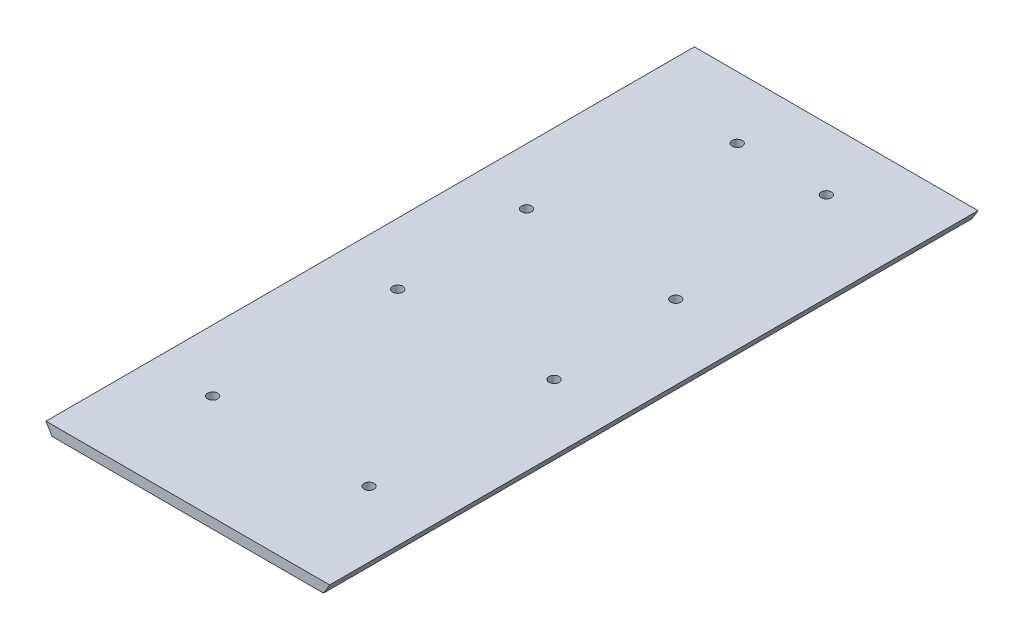
ISO-10303-21;
HEADER;
FILE_DESCRIPTION(('STEP AP214'),'2;1');
FILE_NAME('part.step','',(''),(''),'','','');
FILE_SCHEMA(('AUTOMOTIVE_DESIGN { 1 0 10303 214 1 1 1 1 }'));
ENDSEC;
DATA;
#1=APPLICATION_CONTEXT('core data for automotive mechanical design processes');
#2=APPLICATION_PROTOCOL_DEFINITION('international standard','automotive_design',2000,#1);
#3=PRODUCT_CONTEXT('',#1,'mechanical');
#4=PRODUCT('Part','Part','',(#3));
#5=PRODUCT_RELATED_PRODUCT_CATEGORY('part','',(#4));
#6=PRODUCT_DEFINITION_FORMATION('','',#4);
#7=PRODUCT_DEFINITION_CONTEXT('part definition',#1,'design');
#8=PRODUCT_DEFINITION('design','',#6,#7);
#9=PRODUCT_DEFINITION_SHAPE('','',#8);
#10=(LENGTH_UNIT() NAMED_UNIT(*) SI_UNIT(.MILLI.,.METRE.));
#11=(NAMED_UNIT(*) PLANE_ANGLE_UNIT() SI_UNIT($,.RADIAN.));
#12=(NAMED_UNIT(*) SI_UNIT($,.STERADIAN.) SOLID_ANGLE_UNIT());
#13=UNCERTAINTY_MEASURE_WITH_UNIT(LENGTH_MEASURE(1.E-05),#10,'distance_accuracy_value','');
#14=(GEOMETRIC_REPRESENTATION_CONTEXT(3) GLOBAL_UNCERTAINTY_ASSIGNED_CONTEXT((#13)) GLOBAL_UNIT_ASSIGNED_CONTEXT((#10,
#11,#12)) REPRESENTATION_CONTEXT('',''));
#15=CARTESIAN_POINT('',(0.,0.,0.));
#16=DIRECTION('',(0.,0.,1.));
#17=DIRECTION('',(1.,0.,0.));
#18=AXIS2_PLACEMENT_3D('',#15,#16,#17);
#19=CARTESIAN_POINT('',(42.5222556068552,-27.7938442484171,203.2));
#20=DIRECTION('',(0.,-1.,0.));
#21=DIRECTION('',(0.,0.,-1.));
#22=AXIS2_PLACEMENT_3D('',#19,#20,#21);
#23=PLANE('',#22);
#24=CARTESIAN_POINT('',(-25.15241720624,-27.7938442484171,112.253365494015));
#25=DIRECTION('',(0.,1.,0.));
#26=DIRECTION('',(0.,0.,1.));
#27=AXIS2_PLACEMENT_3D('',#24,#25,#26);
#28=CIRCLE('',#27,1.5875);
#29=CARTESIAN_POINT('',(-25.15241720624,-27.7938442484171,113.840865494015));
#30=VERTEX_POINT('',#29);
#31=EDGE_CURVE('E124',#30,#30,#28,.T.);
#32=ORIENTED_EDGE('',*,*,#31,.T.);
#33=EDGE_LOOP('',(#32));
#34=FACE_BOUND('',#33,.T.);
#35=CARTESIAN_POINT('',(-25.15241720624,-27.7938442484171,170.253365494015));
#36=DIRECTION('',(0.,1.,0.));
#37=DIRECTION('',(0.,0.,1.));
#38=AXIS2_PLACEMENT_3D('',#35,#36,#37);
#39=CIRCLE('',#38,1.5875);
#40=CARTESIAN_POINT('',(-25.15241720624,-27.7938442484171,171.840865494015));
#41=VERTEX_POINT('',#40);
#42=EDGE_CURVE('E138',#41,#41,#39,.F.);
#43=ORIENTED_EDGE('',*,*,#42,.F.);
#44=EDGE_LOOP('',(#43));
#45=FACE_BOUND('',#44,.T.);
#46=CARTESIAN_POINT('',(-11.5382422939092,-27.7938442484171,19.4789252926029));
#47=DIRECTION('',(0.,1.,0.));
#48=DIRECTION('',(0.,0.,1.));
#49=AXIS2_PLACEMENT_3D('',#46,#47,#48);
#50=CIRCLE('',#49,1.5875);
#51=CARTESIAN_POINT('',(-11.5382422939092,-27.7938442484171,21.0664252926029));
#52=VERTEX_POINT('',#51);
#53=EDGE_CURVE('E144',#52,#52,#50,.T.);
#54=ORIENTED_EDGE('',*,*,#53,.T.);
#55=EDGE_LOOP('',(#54));
#56=FACE_BOUND('',#55,.T.);
#57=CARTESIAN_POINT('',(21.1379269920427,-27.7938442484171,71.4219252926028));
#58=DIRECTION('',(0.,1.,0.));
#59=DIRECTION('',(0.,0.,1.));
#60=AXIS2_PLACEMENT_3D('',#57,#58,#59);
#61=CIRCLE('',#60,1.5875);
#62=CARTESIAN_POINT('',(21.1379269920427,-27.7938442484171,73.0094252926028));
#63=VERTEX_POINT('',#62);
#64=EDGE_CURVE('E150',#63,#63,#61,.T.);
#65=ORIENTED_EDGE('',*,*,#64,.T.);
#66=EDGE_LOOP('',(#65));
#67=FACE_BOUND('',#66,.T.);
#68=CARTESIAN_POINT('',(-26.7782422939092,-27.7938442484171,70.2789252926029));
#69=DIRECTION('',(0.,1.,0.));
#70=DIRECTION('',(0.,0.,1.));
#71=AXIS2_PLACEMENT_3D('',#68,#69,#70);
#72=CIRCLE('',#71,1.5875);
#73=CARTESIAN_POINT('',(-26.7782422939092,-27.7938442484171,71.8664252926029));
#74=VERTEX_POINT('',#73);
#75=EDGE_CURVE('E156',#74,#74,#72,.T.);
#76=ORIENTED_EDGE('',*,*,#75,.T.);
#77=EDGE_LOOP('',(#76));
#78=FACE_BOUND('',#77,.T.);
#79=CARTESIAN_POINT('',(16.4017577060908,-27.7938442484171,19.4789252926029));
#80=DIRECTION('',(0.,1.,0.));
#81=DIRECTION('',(0.,0.,1.));
#82=AXIS2_PLACEMENT_3D('',#79,#80,#81);
#83=CIRCLE('',#82,1.5875);
#84=CARTESIAN_POINT('',(16.4017577060908,-27.7938442484171,21.0664252926029));
#85=VERTEX_POINT('',#84);
#86=EDGE_CURVE('E101',#85,#85,#83,.T.);
#87=ORIENTED_EDGE('',*,*,#86,.T.);
#88=EDGE_LOOP('',(#87));
#89=FACE_BOUND('',#88,.T.);
#90=DIRECTION('',(-1.,0.,0.));
#91=VECTOR('',#90,1.);
#92=CARTESIAN_POINT('',(42.5222556068552,-27.7938442484171,0.));
#93=LINE('',#92,#91);
#94=CARTESIAN_POINT('',(42.5222556068552,-27.7938442484171,0.));
#95=VERTEX_POINT('',#94);
#96=CARTESIAN_POINT('',(-42.5222556068552,-27.7938442484171,0.));
#97=VERTEX_POINT('',#96);
#98=EDGE_CURVE('E85',#95,#97,#93,.T.);
#99=ORIENTED_EDGE('',*,*,#98,.F.);
#100=DIRECTION('',(0.,0.,-1.));
#101=VECTOR('',#100,1.);
#102=CARTESIAN_POINT('',(42.5222556068552,-27.7938442484171,203.2));
#103=LINE('',#102,#101);
#104=CARTESIAN_POINT('',(42.5222556068552,-27.7938442484171,203.2));
#105=VERTEX_POINT('',#104);
#106=EDGE_CURVE('E42',#105,#95,#103,.T.);
#107=ORIENTED_EDGE('',*,*,#106,.F.);
#108=DIRECTION('',(-1.,0.,0.));
#109=VECTOR('',#108,1.);
#110=CARTESIAN_POINT('',(42.5222556068552,-27.7938442484171,203.2));
#111=LINE('',#110,#109);
#112=CARTESIAN_POINT('',(-42.5222556068552,-27.7938442484171,203.2));
#113=VERTEX_POINT('',#112);
#114=EDGE_CURVE('E83',#105,#113,#111,.T.);
#115=ORIENTED_EDGE('',*,*,#114,.T.);
#116=DIRECTION('',(0.,0.,-1.));
#117=VECTOR('',#116,1.);
#118=CARTESIAN_POINT('',(-42.5222556068552,-27.7938442484171,203.2));
#119=LINE('',#118,#117);
#120=EDGE_CURVE('E11',#113,#97,#119,.T.);
#121=ORIENTED_EDGE('',*,*,#120,.T.);
#122=EDGE_LOOP('',(#99,#107,#115,#121));
#123=FACE_BOUND('',#122,.T.);
#124=CARTESIAN_POINT('',(23.8475827937601,-27.7938442484171,170.253365494015));
#125=DIRECTION('',(0.,1.,0.));
#126=DIRECTION('',(0.,0.,1.));
#127=AXIS2_PLACEMENT_3D('',#124,#125,#126);
#128=CIRCLE('',#127,1.5875);
#129=CARTESIAN_POINT('',(23.8475827937601,-27.7938442484171,171.840865494015));
#130=VERTEX_POINT('',#129);
#131=EDGE_CURVE('E133',#130,#130,#128,.T.);
#132=ORIENTED_EDGE('',*,*,#131,.T.);
#133=EDGE_LOOP('',(#132));
#134=FACE_BOUND('',#133,.T.);
#135=CARTESIAN_POINT('',(23.8475827937601,-27.7938442484171,112.253365494015));
#136=DIRECTION('',(0.,1.,0.));
#137=DIRECTION('',(0.,0.,1.));
#138=AXIS2_PLACEMENT_3D('',#135,#136,#137);
#139=CIRCLE('',#138,1.5875);
#140=CARTESIAN_POINT('',(23.8475827937601,-27.7938442484171,113.840865494015));
#141=VERTEX_POINT('',#140);
#142=EDGE_CURVE('E123',#141,#141,#139,.F.);
#143=ORIENTED_EDGE('',*,*,#142,.F.);
#144=EDGE_LOOP('',(#143));
#145=FACE_BOUND('',#144,.T.);
#146=ADVANCED_FACE('F33',(#34,#45,#56,#67,#78,#89,#123,#134,#145),#23,.T.);
#147=CARTESIAN_POINT('',(-44.45,-24.5934442484171,203.2));
#148=DIRECTION('',(0.,1.,0.));
#149=DIRECTION('',(0.,0.,1.));
#150=AXIS2_PLACEMENT_3D('',#147,#148,#149);
#151=PLANE('',#150);
#152=CARTESIAN_POINT('',(-25.15241720624,-24.5934442484171,112.253365494015));
#153=DIRECTION('',(0.,1.,0.));
#154=DIRECTION('',(0.,0.,1.));
#155=AXIS2_PLACEMENT_3D('',#152,#153,#154);
#156=CIRCLE('',#155,1.5875);
#157=CARTESIAN_POINT('',(-25.15241720624,-24.5934442484171,113.840865494015));
#158=VERTEX_POINT('',#157);
#159=EDGE_CURVE('E129',#158,#158,#156,.T.);
#160=ORIENTED_EDGE('',*,*,#159,.F.);
#161=EDGE_LOOP('',(#160));
#162=FACE_BOUND('',#161,.T.);
#163=CARTESIAN_POINT('',(-25.15241720624,-24.5934442484171,170.253365494015));
#164=DIRECTION('',(0.,1.,0.));
#165=DIRECTION('',(0.,0.,1.));
#166=AXIS2_PLACEMENT_3D('',#163,#164,#165);
#167=CIRCLE('',#166,1.5875);
#168=CARTESIAN_POINT('',(-25.15241720624,-24.5934442484171,171.840865494015));
#169=VERTEX_POINT('',#168);
#170=EDGE_CURVE('E136',#169,#169,#167,.F.);
#171=ORIENTED_EDGE('',*,*,#170,.T.);
#172=EDGE_LOOP('',(#171));
#173=FACE_BOUND('',#172,.T.);
#174=CARTESIAN_POINT('',(-11.5382422939092,-24.5934442484171,19.4789252926029));
#175=DIRECTION('',(0.,1.,0.));
#176=DIRECTION('',(0.,0.,1.));
#177=AXIS2_PLACEMENT_3D('',#174,#175,#176);
#178=CIRCLE('',#177,1.5875);
#179=CARTESIAN_POINT('',(-11.5382422939092,-24.5934442484171,21.0664252926029));
#180=VERTEX_POINT('',#179);
#181=EDGE_CURVE('E141',#180,#180,#178,.T.);
#182=ORIENTED_EDGE('',*,*,#181,.F.);
#183=EDGE_LOOP('',(#182));
#184=FACE_BOUND('',#183,.T.);
#185=CARTESIAN_POINT('',(21.1379269920427,-24.5934442484171,71.4219252926028));
#186=DIRECTION('',(0.,1.,0.));
#187=DIRECTION('',(0.,0.,1.));
#188=AXIS2_PLACEMENT_3D('',#185,#186,#187);
#189=CIRCLE('',#188,1.5875);
#190=CARTESIAN_POINT('',(21.1379269920427,-24.5934442484171,73.0094252926028));
#191=VERTEX_POINT('',#190);
#192=EDGE_CURVE('E147',#191,#191,#189,.T.);
#193=ORIENTED_EDGE('',*,*,#192,.F.);
#194=EDGE_LOOP('',(#193));
#195=FACE_BOUND('',#194,.T.);
#196=CARTESIAN_POINT('',(-26.7782422939092,-24.5934442484171,70.2789252926029));
#197=DIRECTION('',(0.,1.,0.));
#198=DIRECTION('',(0.,0.,1.));
#199=AXIS2_PLACEMENT_3D('',#196,#197,#198);
#200=CIRCLE('',#199,1.5875);
#201=CARTESIAN_POINT('',(-26.7782422939092,-24.5934442484171,71.8664252926029));
#202=VERTEX_POINT('',#201);
#203=EDGE_CURVE('E153',#202,#202,#200,.T.);
#204=ORIENTED_EDGE('',*,*,#203,.F.);
#205=EDGE_LOOP('',(#204));
#206=FACE_BOUND('',#205,.T.);
#207=CARTESIAN_POINT('',(16.4017577060908,-24.5934442484171,19.4789252926029));
#208=DIRECTION('',(0.,1.,0.));
#209=DIRECTION('',(0.,0.,1.));
#210=AXIS2_PLACEMENT_3D('',#207,#208,#209);
#211=CIRCLE('',#210,1.5875);
#212=CARTESIAN_POINT('',(16.4017577060908,-24.5934442484171,21.0664252926029));
#213=VERTEX_POINT('',#212);
#214=EDGE_CURVE('E159',#213,#213,#211,.T.);
#215=ORIENTED_EDGE('',*,*,#214,.F.);
#216=EDGE_LOOP('',(#215));
#217=FACE_BOUND('',#216,.T.);
#218=DIRECTION('',(1.,0.,0.));
#219=VECTOR('',#218,1.);
#220=CARTESIAN_POINT('',(-44.45,-24.5934442484171,0.));
#221=LINE('',#220,#219);
#222=CARTESIAN_POINT('',(-44.45,-24.5934442484171,0.));
#223=VERTEX_POINT('',#222);
#224=CARTESIAN_POINT('',(44.45,-24.5934442484171,0.));
#225=VERTEX_POINT('',#224);
#226=EDGE_CURVE('E94',#223,#225,#221,.T.);
#227=ORIENTED_EDGE('',*,*,#226,.F.);
#228=DIRECTION('',(0.,0.,-1.));
#229=VECTOR('',#228,1.);
#230=CARTESIAN_POINT('',(-44.45,-24.5934442484171,203.2));
#231=LINE('',#230,#229);
#232=CARTESIAN_POINT('',(-44.45,-24.5934442484171,203.2));
#233=VERTEX_POINT('',#232);
#234=EDGE_CURVE('E50',#233,#223,#231,.T.);
#235=ORIENTED_EDGE('',*,*,#234,.F.);
#236=DIRECTION('',(1.,0.,0.));
#237=VECTOR('',#236,1.);
#238=CARTESIAN_POINT('',(-44.45,-24.5934442484171,203.2));
#239=LINE('',#238,#237);
#240=CARTESIAN_POINT('',(44.45,-24.5934442484171,203.2));
#241=VERTEX_POINT('',#240);
#242=EDGE_CURVE('E90',#233,#241,#239,.T.);
#243=ORIENTED_EDGE('',*,*,#242,.T.);
#244=DIRECTION('',(0.,0.,-1.));
#245=VECTOR('',#244,1.);
#246=CARTESIAN_POINT('',(44.45,-24.5934442484171,203.2));
#247=LINE('',#246,#245);
#248=EDGE_CURVE('E64',#241,#225,#247,.T.);
#249=ORIENTED_EDGE('',*,*,#248,.T.);
#250=EDGE_LOOP('',(#227,#235,#243,#249));
#251=FACE_BOUND('',#250,.T.);
#252=CARTESIAN_POINT('',(23.8475827937601,-24.5934442484171,170.253365494015));
#253=DIRECTION('',(0.,1.,0.));
#254=DIRECTION('',(0.,0.,1.));
#255=AXIS2_PLACEMENT_3D('',#252,#253,#254);
#256=CIRCLE('',#255,1.5875);
#257=CARTESIAN_POINT('',(23.8475827937601,-24.5934442484171,171.840865494015));
#258=VERTEX_POINT('',#257);
#259=EDGE_CURVE('E118',#258,#258,#256,.T.);
#260=ORIENTED_EDGE('',*,*,#259,.F.);
#261=EDGE_LOOP('',(#260));
#262=FACE_BOUND('',#261,.T.);
#263=CARTESIAN_POINT('',(23.8475827937601,-24.5934442484171,112.253365494015));
#264=DIRECTION('',(0.,1.,0.));
#265=DIRECTION('',(0.,0.,1.));
#266=AXIS2_PLACEMENT_3D('',#263,#264,#265);
#267=CIRCLE('',#266,1.5875);
#268=CARTESIAN_POINT('',(23.8475827937601,-24.5934442484171,113.840865494015));
#269=VERTEX_POINT('',#268);
#270=EDGE_CURVE('E121',#269,#269,#267,.F.);
#271=ORIENTED_EDGE('',*,*,#270,.T.);
#272=EDGE_LOOP('',(#271));
#273=FACE_BOUND('',#272,.T.);
#274=ADVANCED_FACE('F110',(#162,#173,#184,#195,#206,#217,#251,#262,#273),#151,.T.);
#275=CARTESIAN_POINT('',(0.,0.,203.2));
#276=DIRECTION('',(0.,0.,-1.));
#277=DIRECTION('',(-1.,0.,0.));
#278=AXIS2_PLACEMENT_3D('',#275,#276,#277);
#279=CYLINDRICAL_SURFACE('',#278,50.8);
#280=CARTESIAN_POINT('',(0.,0.,0.));
#281=DIRECTION('',(0.,0.,1.));
#282=DIRECTION('',(1.,0.,0.));
#283=AXIS2_PLACEMENT_3D('',#280,#281,#282);
#284=CIRCLE('',#283,50.8);
#285=EDGE_CURVE('E99',#223,#97,#284,.T.);
#286=ORIENTED_EDGE('',*,*,#285,.T.);
#287=ORIENTED_EDGE('',*,*,#120,.F.);
#288=CARTESIAN_POINT('',(0.,0.,203.2));
#289=DIRECTION('',(0.,0.,1.));
#290=DIRECTION('',(1.,0.,0.));
#291=AXIS2_PLACEMENT_3D('',#288,#289,#290);
#292=CIRCLE('',#291,50.8);
#293=EDGE_CURVE('E75',#233,#113,#292,.T.);
#294=ORIENTED_EDGE('',*,*,#293,.F.);
#295=ORIENTED_EDGE('',*,*,#234,.T.);
#296=EDGE_LOOP('',(#286,#287,#294,#295));
#297=FACE_BOUND('',#296,.T.);
#298=ADVANCED_FACE('F35',(#297),#279,.T.);
#299=CARTESIAN_POINT('',(0.,0.,203.2));
#300=DIRECTION('',(0.,0.,-1.));
#301=DIRECTION('',(-1.,0.,0.));
#302=AXIS2_PLACEMENT_3D('',#299,#300,#301);
#303=CYLINDRICAL_SURFACE('',#302,50.8);
#304=CARTESIAN_POINT('',(0.,0.,0.));
#305=DIRECTION('',(0.,0.,1.));
#306=DIRECTION('',(1.,0.,0.));
#307=AXIS2_PLACEMENT_3D('',#304,#305,#306);
#308=CIRCLE('',#307,50.8);
#309=EDGE_CURVE('E103',#95,#225,#308,.T.);
#310=ORIENTED_EDGE('',*,*,#309,.T.);
#311=ORIENTED_EDGE('',*,*,#248,.F.);
#312=CARTESIAN_POINT('',(0.,0.,203.2));
#313=DIRECTION('',(0.,0.,1.));
#314=DIRECTION('',(1.,0.,0.));
#315=AXIS2_PLACEMENT_3D('',#312,#313,#314);
#316=CIRCLE('',#315,50.8);
#317=EDGE_CURVE('E88',#105,#241,#316,.T.);
#318=ORIENTED_EDGE('',*,*,#317,.F.);
#319=ORIENTED_EDGE('',*,*,#106,.T.);
#320=EDGE_LOOP('',(#310,#311,#318,#319));
#321=FACE_BOUND('',#320,.T.);
#322=ADVANCED_FACE('F89',(#321),#303,.T.);
#323=CARTESIAN_POINT('',(0.,0.,203.2));
#324=DIRECTION('',(0.,0.,1.));
#325=DIRECTION('',(1.,0.,0.));
#326=AXIS2_PLACEMENT_3D('',#323,#324,#325);
#327=PLANE('',#326);
#328=ORIENTED_EDGE('',*,*,#293,.T.);
#329=ORIENTED_EDGE('',*,*,#114,.F.);
#330=ORIENTED_EDGE('',*,*,#317,.T.);
#331=ORIENTED_EDGE('',*,*,#242,.F.);
#332=EDGE_LOOP('',(#328,#329,#330,#331));
#333=FACE_BOUND('',#332,.T.);
#334=ADVANCED_FACE('F92',(#333),#327,.T.);
#335=CARTESIAN_POINT('',(0.,0.,0.));
#336=DIRECTION('',(0.,0.,1.));
#337=DIRECTION('',(1.,0.,0.));
#338=AXIS2_PLACEMENT_3D('',#335,#336,#337);
#339=PLANE('',#338);
#340=ORIENTED_EDGE('',*,*,#285,.F.);
#341=ORIENTED_EDGE('',*,*,#226,.T.);
#342=ORIENTED_EDGE('',*,*,#309,.F.);
#343=ORIENTED_EDGE('',*,*,#98,.T.);
#344=EDGE_LOOP('',(#340,#341,#342,#343));
#345=FACE_BOUND('',#344,.T.);
#346=ADVANCED_FACE('F109',(#345),#339,.F.);
#347=CARTESIAN_POINT('',(16.4017577060908,-27.7938442484171,19.4789252926029));
#348=DIRECTION('',(0.,1.,0.));
#349=DIRECTION('',(0.,0.,1.));
#350=AXIS2_PLACEMENT_3D('',#347,#348,#349);
#351=CYLINDRICAL_SURFACE('',#350,1.5875);
#352=ORIENTED_EDGE('',*,*,#86,.F.);
#353=EDGE_LOOP('',(#352));
#354=FACE_BOUND('',#353,.T.);
#355=ORIENTED_EDGE('',*,*,#214,.T.);
#356=EDGE_LOOP('',(#355));
#357=FACE_BOUND('',#356,.T.);
#358=ADVANCED_FACE('F166',(#354,#357),#351,.F.);
#359=CARTESIAN_POINT('',(-26.7782422939092,-27.7938442484171,70.2789252926029));
#360=DIRECTION('',(0.,1.,0.));
#361=DIRECTION('',(0.,0.,1.));
#362=AXIS2_PLACEMENT_3D('',#359,#360,#361);
#363=CYLINDRICAL_SURFACE('',#362,1.5875);
#364=ORIENTED_EDGE('',*,*,#75,.F.);
#365=EDGE_LOOP('',(#364));
#366=FACE_BOUND('',#365,.T.);
#367=ORIENTED_EDGE('',*,*,#203,.T.);
#368=EDGE_LOOP('',(#367));
#369=FACE_BOUND('',#368,.T.);
#370=ADVANCED_FACE('F169',(#366,#369),#363,.F.);
#371=CARTESIAN_POINT('',(21.1379269920427,-27.7938442484171,71.4219252926028));
#372=DIRECTION('',(0.,1.,0.));
#373=DIRECTION('',(0.,0.,1.));
#374=AXIS2_PLACEMENT_3D('',#371,#372,#373);
#375=CYLINDRICAL_SURFACE('',#374,1.5875);
#376=ORIENTED_EDGE('',*,*,#64,.F.);
#377=EDGE_LOOP('',(#376));
#378=FACE_BOUND('',#377,.T.);
#379=ORIENTED_EDGE('',*,*,#192,.T.);
#380=EDGE_LOOP('',(#379));
#381=FACE_BOUND('',#380,.T.);
#382=ADVANCED_FACE('F176',(#378,#381),#375,.F.);
#383=CARTESIAN_POINT('',(-11.5382422939092,-27.7938442484171,19.4789252926029));
#384=DIRECTION('',(0.,1.,0.));
#385=DIRECTION('',(0.,0.,1.));
#386=AXIS2_PLACEMENT_3D('',#383,#384,#385);
#387=CYLINDRICAL_SURFACE('',#386,1.5875);
#388=ORIENTED_EDGE('',*,*,#53,.F.);
#389=EDGE_LOOP('',(#388));
#390=FACE_BOUND('',#389,.T.);
#391=ORIENTED_EDGE('',*,*,#181,.T.);
#392=EDGE_LOOP('',(#391));
#393=FACE_BOUND('',#392,.T.);
#394=ADVANCED_FACE('F218',(#390,#393),#387,.F.);
#395=CARTESIAN_POINT('',(-25.15241720624,-27.7938442484171,170.253365494015));
#396=DIRECTION('',(0.,1.,0.));
#397=DIRECTION('',(0.,0.,1.));
#398=AXIS2_PLACEMENT_3D('',#395,#396,#397);
#399=CYLINDRICAL_SURFACE('',#398,1.5875);
#400=ORIENTED_EDGE('',*,*,#42,.T.);
#401=EDGE_LOOP('',(#400));
#402=FACE_BOUND('',#401,.T.);
#403=ORIENTED_EDGE('',*,*,#170,.F.);
#404=EDGE_LOOP('',(#403));
#405=FACE_BOUND('',#404,.T.);
#406=ADVANCED_FACE('F227',(#402,#405),#399,.F.);
#407=CARTESIAN_POINT('',(23.8475827937601,-27.7938442484171,170.253365494015));
#408=DIRECTION('',(0.,1.,0.));
#409=DIRECTION('',(0.,0.,1.));
#410=AXIS2_PLACEMENT_3D('',#407,#408,#409);
#411=CYLINDRICAL_SURFACE('',#410,1.5875);
#412=ORIENTED_EDGE('',*,*,#131,.F.);
#413=EDGE_LOOP('',(#412));
#414=FACE_BOUND('',#413,.T.);
#415=ORIENTED_EDGE('',*,*,#259,.T.);
#416=EDGE_LOOP('',(#415));
#417=FACE_BOUND('',#416,.T.);
#418=ADVANCED_FACE('F248',(#414,#417),#411,.F.);
#419=CARTESIAN_POINT('',(23.8475827937601,-27.7938442484171,112.253365494015));
#420=DIRECTION('',(0.,1.,0.));
#421=DIRECTION('',(0.,0.,1.));
#422=AXIS2_PLACEMENT_3D('',#419,#420,#421);
#423=CYLINDRICAL_SURFACE('',#422,1.5875);
#424=ORIENTED_EDGE('',*,*,#142,.T.);
#425=EDGE_LOOP('',(#424));
#426=FACE_BOUND('',#425,.T.);
#427=ORIENTED_EDGE('',*,*,#270,.F.);
#428=EDGE_LOOP('',(#427));
#429=FACE_BOUND('',#428,.T.);
#430=ADVANCED_FACE('F258',(#426,#429),#423,.F.);
#431=CARTESIAN_POINT('',(-25.15241720624,-27.7938442484171,112.253365494015));
#432=DIRECTION('',(0.,1.,0.));
#433=DIRECTION('',(0.,0.,1.));
#434=AXIS2_PLACEMENT_3D('',#431,#432,#433);
#435=CYLINDRICAL_SURFACE('',#434,1.5875);
#436=ORIENTED_EDGE('',*,*,#31,.F.);
#437=EDGE_LOOP('',(#436));
#438=FACE_BOUND('',#437,.T.);
#439=ORIENTED_EDGE('',*,*,#159,.T.);
#440=EDGE_LOOP('',(#439));
#441=FACE_BOUND('',#440,.T.);
#442=ADVANCED_FACE('F268',(#438,#441),#435,.F.);
#443=CLOSED_SHELL('',(#146,#274,#298,#322,#334,#346,#358,#370,#382,#394,#406,#418,#430,#442));
#444=MANIFOLD_SOLID_BREP('B2',#443);
#445=ADVANCED_BREP_SHAPE_REPRESENTATION('',(#18,#444),#14);
#446=SHAPE_DEFINITION_REPRESENTATION(#9,#445);
ENDSEC;
END-ISO-10303-21;
